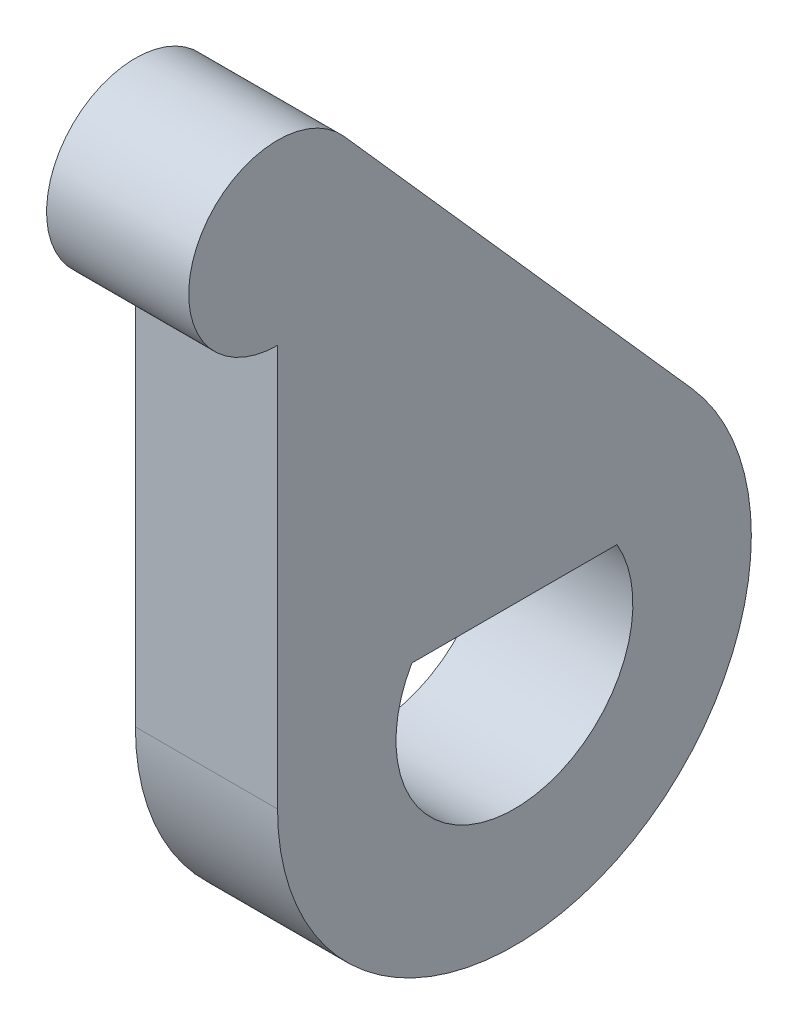
ISO-10303-21;
HEADER;
FILE_DESCRIPTION(('STEP AP214'),'2;1');
FILE_NAME('part.step','',(''),(''),'','','');
FILE_SCHEMA(('AUTOMOTIVE_DESIGN { 1 0 10303 214 1 1 1 1 }'));
ENDSEC;
DATA;
#1=APPLICATION_CONTEXT('core data for automotive mechanical design processes');
#2=APPLICATION_PROTOCOL_DEFINITION('international standard','automotive_design',2000,#1);
#3=PRODUCT_CONTEXT('',#1,'mechanical');
#4=PRODUCT('Part','Part','',(#3));
#5=PRODUCT_RELATED_PRODUCT_CATEGORY('part','',(#4));
#6=PRODUCT_DEFINITION_FORMATION('','',#4);
#7=PRODUCT_DEFINITION_CONTEXT('part definition',#1,'design');
#8=PRODUCT_DEFINITION('design','',#6,#7);
#9=PRODUCT_DEFINITION_SHAPE('','',#8);
#10=(LENGTH_UNIT() NAMED_UNIT(*) SI_UNIT(.MILLI.,.METRE.));
#11=(NAMED_UNIT(*) PLANE_ANGLE_UNIT() SI_UNIT($,.RADIAN.));
#12=(NAMED_UNIT(*) SI_UNIT($,.STERADIAN.) SOLID_ANGLE_UNIT());
#13=UNCERTAINTY_MEASURE_WITH_UNIT(LENGTH_MEASURE(1.E-05),#10,'distance_accuracy_value','');
#14=(GEOMETRIC_REPRESENTATION_CONTEXT(3) GLOBAL_UNCERTAINTY_ASSIGNED_CONTEXT((#13)) GLOBAL_UNIT_ASSIGNED_CONTEXT((#10,
#11,#12)) REPRESENTATION_CONTEXT('',''));
#15=CARTESIAN_POINT('',(0.,0.,0.));
#16=DIRECTION('',(0.,0.,1.));
#17=DIRECTION('',(1.,0.,0.));
#18=AXIS2_PLACEMENT_3D('',#15,#16,#17);
#19=CARTESIAN_POINT('',(3.81,0.,0.));
#20=DIRECTION('',(1.,0.,0.));
#21=DIRECTION('',(0.,0.,-1.));
#22=AXIS2_PLACEMENT_3D('',#19,#20,#21);
#23=PLANE('',#22);
#24=CARTESIAN_POINT('',(3.81,0.,0.));
#25=DIRECTION('',(1.,0.,0.));
#26=DIRECTION('',(0.,0.,-1.));
#27=AXIS2_PLACEMENT_3D('',#24,#25,#26);
#28=CIRCLE('',#27,12.7);
#29=CARTESIAN_POINT('',(3.81,0.,12.7));
#30=VERTEX_POINT('',#29);
#31=CARTESIAN_POINT('',(3.81,8.42573540799414,-9.50247245902213));
#32=VERTEX_POINT('',#31);
#33=EDGE_CURVE('E102',#30,#32,#28,.T.);
#34=ORIENTED_EDGE('',*,*,#33,.T.);
#35=DIRECTION('',(0.,0.748226177875758,0.663443732912924));
#36=VECTOR('',#35,1.);
#37=CARTESIAN_POINT('',(3.81,29.4466915530308,9.1365728278667));
#38=LINE('',#37,#36);
#39=CARTESIAN_POINT('',(3.81,29.4466915530308,9.1365728278667));
#40=VERTEX_POINT('',#39);
#41=EDGE_CURVE('E105',#32,#40,#38,.T.);
#42=ORIENTED_EDGE('',*,*,#41,.T.);
#43=CARTESIAN_POINT('',(3.81,26.287040775033,12.7));
#44=DIRECTION('',(1.,0.,0.));
#45=DIRECTION('',(0.,0.,-1.));
#46=AXIS2_PLACEMENT_3D('',#43,#44,#45);
#47=CIRCLE('',#46,4.7625);
#48=CARTESIAN_POINT('',(3.81,21.524540775033,12.7));
#49=VERTEX_POINT('',#48);
#50=EDGE_CURVE('E108',#40,#49,#47,.T.);
#51=ORIENTED_EDGE('',*,*,#50,.T.);
#52=DIRECTION('',(0.,-1.,0.));
#53=VECTOR('',#52,1.);
#54=CARTESIAN_POINT('',(3.81,0.,12.7));
#55=LINE('',#54,#53);
#56=EDGE_CURVE('E110',#49,#30,#55,.T.);
#57=ORIENTED_EDGE('',*,*,#56,.T.);
#58=EDGE_LOOP('',(#34,#42,#51,#57));
#59=FACE_BOUND('',#58,.T.);
#60=DIRECTION('',(0.,0.,1.));
#61=VECTOR('',#60,1.);
#62=CARTESIAN_POINT('',(3.81,3.17527938770748,5.4991));
#63=LINE('',#62,#61);
#64=CARTESIAN_POINT('',(3.81,3.17527938770748,-5.4991));
#65=VERTEX_POINT('',#64);
#66=CARTESIAN_POINT('',(3.81,3.17527938770748,5.4991));
#67=VERTEX_POINT('',#66);
#68=EDGE_CURVE('E85',#65,#67,#63,.T.);
#69=ORIENTED_EDGE('',*,*,#68,.F.);
#70=CARTESIAN_POINT('',(3.81,0.,0.));
#71=DIRECTION('',(1.,0.,0.));
#72=DIRECTION('',(0.,0.,-1.));
#73=AXIS2_PLACEMENT_3D('',#70,#71,#72);
#74=CIRCLE('',#73,6.35);
#75=EDGE_CURVE('E91',#67,#65,#74,.T.);
#76=ORIENTED_EDGE('',*,*,#75,.F.);
#77=EDGE_LOOP('',(#69,#76));
#78=FACE_BOUND('',#77,.T.);
#79=ADVANCED_FACE('F33',(#59,#78),#23,.T.);
#80=CARTESIAN_POINT('',(-3.81,0.,0.));
#81=DIRECTION('',(1.,0.,0.));
#82=DIRECTION('',(0.,0.,-1.));
#83=AXIS2_PLACEMENT_3D('',#80,#81,#82);
#84=PLANE('',#83);
#85=CARTESIAN_POINT('',(-3.81,0.,0.));
#86=DIRECTION('',(1.,0.,0.));
#87=DIRECTION('',(0.,0.,-1.));
#88=AXIS2_PLACEMENT_3D('',#85,#86,#87);
#89=CIRCLE('',#88,12.7);
#90=CARTESIAN_POINT('',(-3.81,0.,12.7));
#91=VERTEX_POINT('',#90);
#92=CARTESIAN_POINT('',(-3.81,8.42573540799414,-9.50247245902213));
#93=VERTEX_POINT('',#92);
#94=EDGE_CURVE('E101',#91,#93,#89,.T.);
#95=ORIENTED_EDGE('',*,*,#94,.F.);
#96=DIRECTION('',(0.,-1.,0.));
#97=VECTOR('',#96,1.);
#98=CARTESIAN_POINT('',(-3.81,0.,12.7));
#99=LINE('',#98,#97);
#100=CARTESIAN_POINT('',(-3.81,21.524540775033,12.7));
#101=VERTEX_POINT('',#100);
#102=EDGE_CURVE('E106',#101,#91,#99,.T.);
#103=ORIENTED_EDGE('',*,*,#102,.F.);
#104=CARTESIAN_POINT('',(-3.81,26.287040775033,12.7));
#105=DIRECTION('',(1.,0.,0.));
#106=DIRECTION('',(0.,0.,-1.));
#107=AXIS2_PLACEMENT_3D('',#104,#105,#106);
#108=CIRCLE('',#107,4.7625);
#109=CARTESIAN_POINT('',(-3.81,29.4466915530308,9.1365728278667));
#110=VERTEX_POINT('',#109);
#111=EDGE_CURVE('E117',#110,#101,#108,.T.);
#112=ORIENTED_EDGE('',*,*,#111,.F.);
#113=DIRECTION('',(0.,0.748226177875758,0.663443732912924));
#114=VECTOR('',#113,1.);
#115=CARTESIAN_POINT('',(-3.81,29.4466915530308,9.1365728278667));
#116=LINE('',#115,#114);
#117=EDGE_CURVE('E115',#93,#110,#116,.T.);
#118=ORIENTED_EDGE('',*,*,#117,.F.);
#119=EDGE_LOOP('',(#95,#103,#112,#118));
#120=FACE_BOUND('',#119,.T.);
#121=CARTESIAN_POINT('',(-3.81,0.,0.));
#122=DIRECTION('',(1.,0.,0.));
#123=DIRECTION('',(0.,0.,-1.));
#124=AXIS2_PLACEMENT_3D('',#121,#122,#123);
#125=CIRCLE('',#124,6.35);
#126=CARTESIAN_POINT('',(-3.81,3.17527938770748,5.4991));
#127=VERTEX_POINT('',#126);
#128=CARTESIAN_POINT('',(-3.81,3.17527938770748,-5.4991));
#129=VERTEX_POINT('',#128);
#130=EDGE_CURVE('E55',#127,#129,#125,.T.);
#131=ORIENTED_EDGE('',*,*,#130,.T.);
#132=DIRECTION('',(0.,0.,1.));
#133=VECTOR('',#132,1.);
#134=CARTESIAN_POINT('',(-3.81,3.17527938770748,5.4991));
#135=LINE('',#134,#133);
#136=EDGE_CURVE('E95',#129,#127,#135,.T.);
#137=ORIENTED_EDGE('',*,*,#136,.T.);
#138=EDGE_LOOP('',(#131,#137));
#139=FACE_BOUND('',#138,.T.);
#140=ADVANCED_FACE('F135',(#120,#139),#84,.F.);
#141=CARTESIAN_POINT('',(3.81,0.,0.));
#142=DIRECTION('',(-1.,0.,0.));
#143=DIRECTION('',(0.,0.,1.));
#144=AXIS2_PLACEMENT_3D('',#141,#142,#143);
#145=CYLINDRICAL_SURFACE('',#144,12.7);
#146=ORIENTED_EDGE('',*,*,#94,.T.);
#147=DIRECTION('',(-1.,0.,0.));
#148=VECTOR('',#147,1.);
#149=CARTESIAN_POINT('',(3.81,8.42573540799414,-9.50247245902213));
#150=LINE('',#149,#148);
#151=EDGE_CURVE('E11',#32,#93,#150,.T.);
#152=ORIENTED_EDGE('',*,*,#151,.F.);
#153=ORIENTED_EDGE('',*,*,#33,.F.);
#154=DIRECTION('',(-1.,0.,0.));
#155=VECTOR('',#154,1.);
#156=CARTESIAN_POINT('',(3.81,0.,12.7));
#157=LINE('',#156,#155);
#158=EDGE_CURVE('E112',#30,#91,#157,.T.);
#159=ORIENTED_EDGE('',*,*,#158,.T.);
#160=EDGE_LOOP('',(#146,#152,#153,#159));
#161=FACE_BOUND('',#160,.T.);
#162=ADVANCED_FACE('F35',(#161),#145,.T.);
#163=CARTESIAN_POINT('',(3.81,29.4466915530308,9.1365728278667));
#164=DIRECTION('',(0.,-0.663443732912924,0.748226177875758));
#165=DIRECTION('',(0.,-0.748226177875758,-0.663443732912924));
#166=AXIS2_PLACEMENT_3D('',#163,#164,#165);
#167=PLANE('',#166);
#168=ORIENTED_EDGE('',*,*,#117,.T.);
#169=DIRECTION('',(-1.,0.,0.));
#170=VECTOR('',#169,1.);
#171=CARTESIAN_POINT('',(3.81,29.4466915530308,9.1365728278667));
#172=LINE('',#171,#170);
#173=EDGE_CURVE('E41',#40,#110,#172,.T.);
#174=ORIENTED_EDGE('',*,*,#173,.F.);
#175=ORIENTED_EDGE('',*,*,#41,.F.);
#176=ORIENTED_EDGE('',*,*,#151,.T.);
#177=EDGE_LOOP('',(#168,#174,#175,#176));
#178=FACE_BOUND('',#177,.T.);
#179=ADVANCED_FACE('F145',(#178),#167,.F.);
#180=CARTESIAN_POINT('',(3.81,26.287040775033,12.7));
#181=DIRECTION('',(-1.,0.,0.));
#182=DIRECTION('',(0.,0.,1.));
#183=AXIS2_PLACEMENT_3D('',#180,#181,#182);
#184=CYLINDRICAL_SURFACE('',#183,4.7625);
#185=ORIENTED_EDGE('',*,*,#111,.T.);
#186=DIRECTION('',(-1.,0.,0.));
#187=VECTOR('',#186,1.);
#188=CARTESIAN_POINT('',(3.81,21.524540775033,12.7));
#189=LINE('',#188,#187);
#190=EDGE_CURVE('E122',#49,#101,#189,.T.);
#191=ORIENTED_EDGE('',*,*,#190,.F.);
#192=ORIENTED_EDGE('',*,*,#50,.F.);
#193=ORIENTED_EDGE('',*,*,#173,.T.);
#194=EDGE_LOOP('',(#185,#191,#192,#193));
#195=FACE_BOUND('',#194,.T.);
#196=ADVANCED_FACE('F129',(#195),#184,.T.);
#197=CARTESIAN_POINT('',(3.81,0.,12.7));
#198=DIRECTION('',(0.,0.,-1.));
#199=DIRECTION('',(0.,1.,0.));
#200=AXIS2_PLACEMENT_3D('',#197,#198,#199);
#201=PLANE('',#200);
#202=ORIENTED_EDGE('',*,*,#102,.T.);
#203=ORIENTED_EDGE('',*,*,#158,.F.);
#204=ORIENTED_EDGE('',*,*,#56,.F.);
#205=ORIENTED_EDGE('',*,*,#190,.T.);
#206=EDGE_LOOP('',(#202,#203,#204,#205));
#207=FACE_BOUND('',#206,.T.);
#208=ADVANCED_FACE('F139',(#207),#201,.F.);
#209=CARTESIAN_POINT('',(3.81,0.,0.));
#210=DIRECTION('',(-1.,0.,0.));
#211=DIRECTION('',(0.,0.,1.));
#212=AXIS2_PLACEMENT_3D('',#209,#210,#211);
#213=CYLINDRICAL_SURFACE('',#212,6.35);
#214=ORIENTED_EDGE('',*,*,#130,.F.);
#215=DIRECTION('',(-1.,0.,0.));
#216=VECTOR('',#215,1.);
#217=CARTESIAN_POINT('',(3.81,3.17527938770748,5.4991));
#218=LINE('',#217,#216);
#219=EDGE_CURVE('E87',#67,#127,#218,.T.);
#220=ORIENTED_EDGE('',*,*,#219,.F.);
#221=ORIENTED_EDGE('',*,*,#75,.T.);
#222=DIRECTION('',(-1.,0.,0.));
#223=VECTOR('',#222,1.);
#224=CARTESIAN_POINT('',(3.81,3.17527938770748,-5.4991));
#225=LINE('',#224,#223);
#226=EDGE_CURVE('E48',#65,#129,#225,.T.);
#227=ORIENTED_EDGE('',*,*,#226,.T.);
#228=EDGE_LOOP('',(#214,#220,#221,#227));
#229=FACE_BOUND('',#228,.T.);
#230=ADVANCED_FACE('F93',(#229),#213,.F.);
#231=CARTESIAN_POINT('',(3.81,3.17527938770748,5.4991));
#232=DIRECTION('',(0.,-1.,0.));
#233=DIRECTION('',(0.,0.,-1.));
#234=AXIS2_PLACEMENT_3D('',#231,#232,#233);
#235=PLANE('',#234);
#236=ORIENTED_EDGE('',*,*,#136,.F.);
#237=ORIENTED_EDGE('',*,*,#226,.F.);
#238=ORIENTED_EDGE('',*,*,#68,.T.);
#239=ORIENTED_EDGE('',*,*,#219,.T.);
#240=EDGE_LOOP('',(#236,#237,#238,#239));
#241=FACE_BOUND('',#240,.T.);
#242=ADVANCED_FACE('F86',(#241),#235,.T.);
#243=CLOSED_SHELL('',(#79,#140,#162,#179,#196,#208,#230,#242));
#244=MANIFOLD_SOLID_BREP('B2',#243);
#245=ADVANCED_BREP_SHAPE_REPRESENTATION('',(#18,#244),#14);
#246=SHAPE_DEFINITION_REPRESENTATION(#9,#245);
ENDSEC;
END-ISO-10303-21;
